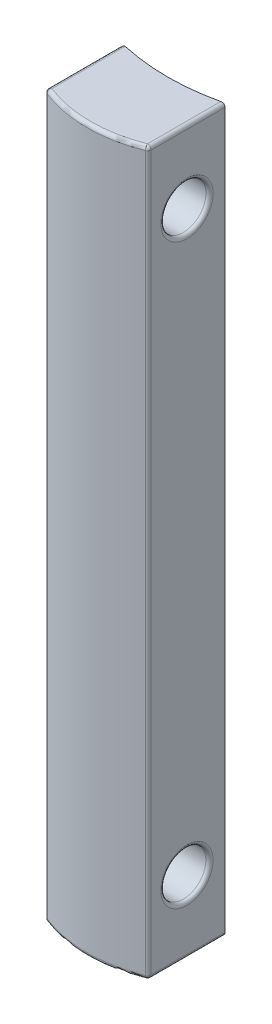
ISO-10303-21;
HEADER;
FILE_DESCRIPTION(('STEP AP214'),'2;1');
FILE_NAME('part.step','',(''),(''),'','','');
FILE_SCHEMA(('AUTOMOTIVE_DESIGN { 1 0 10303 214 1 1 1 1 }'));
ENDSEC;
DATA;
#1=APPLICATION_CONTEXT('core data for automotive mechanical design processes');
#2=APPLICATION_PROTOCOL_DEFINITION('international standard','automotive_design',2000,#1);
#3=PRODUCT_CONTEXT('',#1,'mechanical');
#4=PRODUCT('Part','Part','',(#3));
#5=PRODUCT_RELATED_PRODUCT_CATEGORY('part','',(#4));
#6=PRODUCT_DEFINITION_FORMATION('','',#4);
#7=PRODUCT_DEFINITION_CONTEXT('part definition',#1,'design');
#8=PRODUCT_DEFINITION('design','',#6,#7);
#9=PRODUCT_DEFINITION_SHAPE('','',#8);
#10=(LENGTH_UNIT() NAMED_UNIT(*) SI_UNIT(.MILLI.,.METRE.));
#11=(NAMED_UNIT(*) PLANE_ANGLE_UNIT() SI_UNIT($,.RADIAN.));
#12=(NAMED_UNIT(*) SI_UNIT($,.STERADIAN.) SOLID_ANGLE_UNIT());
#13=UNCERTAINTY_MEASURE_WITH_UNIT(LENGTH_MEASURE(1.E-05),#10,'distance_accuracy_value','');
#14=(GEOMETRIC_REPRESENTATION_CONTEXT(3) GLOBAL_UNCERTAINTY_ASSIGNED_CONTEXT((#13)) GLOBAL_UNIT_ASSIGNED_CONTEXT((#10,
#11,#12)) REPRESENTATION_CONTEXT('',''));
#15=CARTESIAN_POINT('',(0.,0.,0.));
#16=DIRECTION('',(0.,0.,1.));
#17=DIRECTION('',(1.,0.,0.));
#18=AXIS2_PLACEMENT_3D('',#15,#16,#17);
#19=CARTESIAN_POINT('',(0.,254.,-57.5715581610643));
#20=DIRECTION('',(0.,-1.,0.));
#21=DIRECTION('',(0.,0.,-1.));
#22=AXIS2_PLACEMENT_3D('',#19,#20,#21);
#23=CYLINDRICAL_SURFACE('',#22,76.2);
#24=CARTESIAN_POINT('',(0.,0.,-57.5715581610643));
#25=DIRECTION('',(0.,-1.,0.));
#26=DIRECTION('',(0.,0.,1.));
#27=AXIS2_PLACEMENT_3D('',#24,#25,#26);
#28=CIRCLE('',#27,76.2);
#29=CARTESIAN_POINT('',(16.8275,0.,16.747182703875));
#30=VERTEX_POINT('',#29);
#31=CARTESIAN_POINT('',(-16.5516393442623,0.,16.8091062283956));
#32=VERTEX_POINT('',#31);
#33=EDGE_CURVE('E333',#30,#32,#28,.T.);
#34=ORIENTED_EDGE('',*,*,#33,.T.);
#35=DIRECTION('',(0.,-1.,0.));
#36=VECTOR('',#35,1.);
#37=CARTESIAN_POINT('',(-16.5516393442623,254.,16.8091062283956));
#38=LINE('',#37,#36);
#39=CARTESIAN_POINT('',(-16.5516393442623,254.,16.8091062283956));
#40=VERTEX_POINT('',#39);
#41=EDGE_CURVE('E11',#32,#40,#38,.F.);
#42=ORIENTED_EDGE('',*,*,#41,.T.);
#43=CARTESIAN_POINT('',(0.,254.,-57.5715581610643));
#44=DIRECTION('',(0.,-1.,0.));
#45=DIRECTION('',(0.,0.,1.));
#46=AXIS2_PLACEMENT_3D('',#43,#44,#45);
#47=CIRCLE('',#46,76.2);
#48=CARTESIAN_POINT('',(16.8275,254.,16.747182703875));
#49=VERTEX_POINT('',#48);
#50=EDGE_CURVE('E133',#49,#40,#47,.T.);
#51=ORIENTED_EDGE('',*,*,#50,.F.);
#52=CARTESIAN_POINT('',(16.8275,254.,16.747182703875));
#53=CARTESIAN_POINT('',(16.8639896154446,253.999999255623,16.7389207577266));
#54=CARTESIAN_POINT('',(16.9004555622564,253.998426447852,16.7306355715348));
#55=CARTESIAN_POINT('',(16.9731178791203,253.992151677928,16.7140706972601));
#56=CARTESIAN_POINT('',(17.0093142530208,253.987449760534,16.7057910091004));
#57=CARTESIAN_POINT('',(17.117096876584,253.968684983386,16.6810539480163));
#58=CARTESIAN_POINT('',(17.187948906688,253.949963032734,16.6646822066409));
#59=CARTESIAN_POINT('',(17.3255488662206,253.900556070991,16.6326894504217));
#60=CARTESIAN_POINT('',(17.3922941006671,253.869863299272,16.6170689299855));
#61=CARTESIAN_POINT('',(17.5197038858787,253.797296881884,16.5870843439642));
#62=CARTESIAN_POINT('',(17.580370523602,253.755427091826,16.5727198473669));
#63=CARTESIAN_POINT('',(17.6931925521212,253.662085134973,16.5458775267117));
#64=CARTESIAN_POINT('',(17.7454294203061,253.610716671703,16.533381739601));
#65=CARTESIAN_POINT('',(17.8405011805224,253.499467261713,16.5105511135447));
#66=CARTESIAN_POINT('',(17.8833349408527,253.439585291786,16.5002165347162));
#67=CARTESIAN_POINT('',(17.9572047047573,253.314640232585,16.4823425628869));
#68=CARTESIAN_POINT('',(17.9885109280943,253.24974583488,16.4747392663632));
#69=CARTESIAN_POINT('',(18.0397406208682,253.115393440045,16.4622750517539));
#70=CARTESIAN_POINT('',(18.0596754978668,253.045940094677,16.4574113853745));
#71=CARTESIAN_POINT('',(18.0815369441594,252.934915920895,16.4520737763313));
#72=CARTESIAN_POINT('',(18.0875197300893,252.894148018241,16.4506118791123));
#73=CARTESIAN_POINT('',(18.0954998522558,252.812260166365,16.448661316185));
#74=CARTESIAN_POINT('',(18.0975028917215,252.771140805857,16.4481712577721));
#75=CARTESIAN_POINT('',(18.0975,252.73,16.4481722744756));
#76=B_SPLINE_CURVE_WITH_KNOTS('',3,(#52,#53,#54,#55,#56,#57,#58,#59,#60,#61,#62,#63,#64,#65,#66,
#67,#68,#69,#70,#71,#72,#73,#74,#75),.UNSPECIFIED.,.F.,.F.,(4,2,2,2,2,2,2,2,2,2,2,4),(0.,
0.112171064517658,0.224340524551698,0.448459921117349,0.672724855447007,0.896912527389801,
1.11878341774069,1.34068099650411,1.55698405247116,1.77306973315216,1.89657568289654,
2.01990451275881),.UNSPECIFIED.);
#77=CARTESIAN_POINT('',(18.0975,252.73,16.4481722744756));
#78=VERTEX_POINT('',#77);
#79=EDGE_CURVE('E127',#49,#78,#76,.T.);
#80=ORIENTED_EDGE('',*,*,#79,.T.);
#81=DIRECTION('',(0.,-1.,0.));
#82=VECTOR('',#81,1.);
#83=CARTESIAN_POINT('',(18.0975,254.,16.4481722744756));
#84=LINE('',#83,#82);
#85=CARTESIAN_POINT('',(18.0975,1.26999999999999,16.4481722744756));
#86=VERTEX_POINT('',#85);
#87=EDGE_CURVE('E130',#78,#86,#84,.T.);
#88=ORIENTED_EDGE('',*,*,#87,.T.);
#89=CARTESIAN_POINT('',(18.0975,1.26999999999999,16.4481722744756));
#90=CARTESIAN_POINT('',(18.0975002994971,1.23499416079788,16.4481720551778));
#91=CARTESIAN_POINT('',(18.0960517171084,1.20000537635232,16.4485263892362));
#92=CARTESIAN_POINT('',(18.0902763082318,1.1302842807499,16.4499381503823));
#93=CARTESIAN_POINT('',(18.0859497959961,1.09555194200938,16.450995500705));
#94=CARTESIAN_POINT('',(18.0687105809522,0.992231907847696,16.4552062326437));
#95=CARTESIAN_POINT('',(18.0515379752854,0.924346212941687,16.459398361635));
#96=CARTESIAN_POINT('',(18.006388887891,0.79252409307302,16.470392731223));
#97=CARTESIAN_POINT('',(17.978410434683,0.728588391240104,16.4771954481087));
#98=CARTESIAN_POINT('',(17.9125369537443,0.60636419225183,16.4931578929706));
#99=CARTESIAN_POINT('',(17.8746412898318,0.548076057712462,16.5023177721564));
#100=CARTESIAN_POINT('',(17.7895374109295,0.437960695614619,16.5228025752616));
#101=CARTESIAN_POINT('',(17.7422156464106,0.386226249688765,16.5341538400569));
#102=CARTESIAN_POINT('',(17.6399599863692,0.291392389241404,16.5585610241039));
#103=CARTESIAN_POINT('',(17.5850242113896,0.248295113180033,16.5716173641936));
#104=CARTESIAN_POINT('',(17.467519939505,0.170744282521786,16.5993895482886));
#105=CARTESIAN_POINT('',(17.4047858805322,0.136554415411501,16.6141405840076));
#106=CARTESIAN_POINT('',(17.2746745304595,0.0792078885385913,16.6445457298723));
#107=CARTESIAN_POINT('',(17.207298402425,0.0560484765309954,16.6601996136513));
#108=CARTESIAN_POINT('',(17.0876948582205,0.0258327839098748,16.6878076230442));
#109=CARTESIAN_POINT('',(17.0360903788796,0.0161538457197487,16.6996639256655));
#110=CARTESIAN_POINT('',(16.9321673502344,0.00323718304959946,16.7234254207536));
#111=CARTESIAN_POINT('',(16.87984986152,-9.23856613449047E-06,16.7353305253695));
#112=CARTESIAN_POINT('',(16.8275,0.,16.747182703875));
#113=B_SPLINE_CURVE_WITH_KNOTS('',3,(#89,#90,#91,#92,#93,#94,#95,#96,#97,#98,#99,#100,#101,#102,
#103,#104,#105,#106,#107,#108,#109,#110,#111,#112),.UNSPECIFIED.,.F.,.F.,(4,2,2,2,2,2,2,2,2,2,2,
4),(0.,0.104952045724521,0.209892633211034,0.419255642430889,0.628656867088506,
0.838071527970875,1.05018070038622,1.26234232379802,1.48021081926794,1.69802492514076,
1.85913105207359,2.02001920513117),.UNSPECIFIED.);
#114=EDGE_CURVE('E53',#86,#30,#113,.T.);
#115=ORIENTED_EDGE('',*,*,#114,.T.);
#116=EDGE_LOOP('',(#34,#42,#51,#80,#88,#115));
#117=FACE_BOUND('',#116,.T.);
#118=ADVANCED_FACE('F43',(#117),#23,.F.);
#119=CARTESIAN_POINT('',(-18.0975,254.,16.4481722744756));
#120=DIRECTION('',(1.,0.,0.));
#121=DIRECTION('',(0.,0.,-1.));
#122=AXIS2_PLACEMENT_3D('',#119,#120,#121);
#123=PLANE('',#122);
#124=CARTESIAN_POINT('',(-18.0975,228.6,29.9066862681608));
#125=DIRECTION('',(1.,0.,0.));
#126=DIRECTION('',(0.,0.,-1.));
#127=AXIS2_PLACEMENT_3D('',#124,#125,#126);
#128=CIRCLE('',#127,9.2075);
#129=CARTESIAN_POINT('',(-18.0975,228.6,20.6991862681608));
#130=VERTEX_POINT('',#129);
#131=EDGE_CURVE('E189',#130,#130,#128,.T.);
#132=ORIENTED_EDGE('',*,*,#131,.T.);
#133=EDGE_LOOP('',(#132));
#134=FACE_BOUND('',#133,.T.);
#135=CARTESIAN_POINT('',(-18.0975,25.4,29.9066862681608));
#136=DIRECTION('',(1.,0.,0.));
#137=DIRECTION('',(0.,0.,-1.));
#138=AXIS2_PLACEMENT_3D('',#135,#136,#137);
#139=CIRCLE('',#138,9.2075);
#140=CARTESIAN_POINT('',(-18.0975,25.4,20.6991862681608));
#141=VERTEX_POINT('',#140);
#142=EDGE_CURVE('E185',#141,#141,#139,.T.);
#143=ORIENTED_EDGE('',*,*,#142,.T.);
#144=EDGE_LOOP('',(#143));
#145=FACE_BOUND('',#144,.T.);
#146=DIRECTION('',(0.,-1.,0.));
#147=VECTOR('',#146,1.);
#148=CARTESIAN_POINT('',(-18.0975,254.,18.0487839682199));
#149=LINE('',#148,#147);
#150=CARTESIAN_POINT('',(-18.0975,252.73,18.0487839682199));
#151=VERTEX_POINT('',#150);
#152=CARTESIAN_POINT('',(-18.0975,1.26999999999999,18.0487839682199));
#153=VERTEX_POINT('',#152);
#154=EDGE_CURVE('E178',#151,#153,#149,.T.);
#155=ORIENTED_EDGE('',*,*,#154,.T.);
#156=DIRECTION('',(0.,0.,1.));
#157=VECTOR('',#156,1.);
#158=CARTESIAN_POINT('',(-18.0975,1.26999999999999,16.4481722744756));
#159=LINE('',#158,#157);
#160=CARTESIAN_POINT('',(-18.0975,1.26999999999999,42.5106297736225));
#161=VERTEX_POINT('',#160);
#162=EDGE_CURVE('E181',#153,#161,#159,.T.);
#163=ORIENTED_EDGE('',*,*,#162,.T.);
#164=DIRECTION('',(0.,-1.,0.));
#165=VECTOR('',#164,1.);
#166=CARTESIAN_POINT('',(-18.0975,254.,42.5106297736225));
#167=LINE('',#166,#165);
#168=CARTESIAN_POINT('',(-18.0975,252.73,42.5106297736225));
#169=VERTEX_POINT('',#168);
#170=EDGE_CURVE('E172',#161,#169,#167,.F.);
#171=ORIENTED_EDGE('',*,*,#170,.T.);
#172=DIRECTION('',(0.,0.,1.));
#173=VECTOR('',#172,1.);
#174=CARTESIAN_POINT('',(-18.0975,252.73,16.4481722744756));
#175=LINE('',#174,#173);
#176=EDGE_CURVE('E175',#169,#151,#175,.F.);
#177=ORIENTED_EDGE('',*,*,#176,.T.);
#178=EDGE_LOOP('',(#155,#163,#171,#177));
#179=FACE_BOUND('',#178,.T.);
#180=ADVANCED_FACE('F253',(#134,#145,#179),#123,.F.);
#181=CARTESIAN_POINT('',(0.,254.,0.));
#182=DIRECTION('',(0.,-1.,0.));
#183=DIRECTION('',(0.,0.,-1.));
#184=AXIS2_PLACEMENT_3D('',#181,#182,#183);
#185=CYLINDRICAL_SURFACE('',#184,46.99);
#186=CARTESIAN_POINT('',(0.,252.73,0.));
#187=DIRECTION('',(0.,1.,0.));
#188=DIRECTION('',(0.,0.,1.));
#189=AXIS2_PLACEMENT_3D('',#186,#187,#188);
#190=CIRCLE('',#189,46.99);
#191=CARTESIAN_POINT('',(17.2949305555556,252.73,43.6914806006676));
#192=VERTEX_POINT('',#191);
#193=CARTESIAN_POINT('',(-17.2949305555556,252.73,43.6914806006676));
#194=VERTEX_POINT('',#193);
#195=EDGE_CURVE('E220',#192,#194,#190,.F.);
#196=ORIENTED_EDGE('',*,*,#195,.T.);
#197=DIRECTION('',(0.,-1.,0.));
#198=VECTOR('',#197,1.);
#199=CARTESIAN_POINT('',(-17.2949305555556,254.,43.6914806006676));
#200=LINE('',#199,#198);
#201=CARTESIAN_POINT('',(-17.2949305555556,1.26999999999999,43.6914806006676));
#202=VERTEX_POINT('',#201);
#203=EDGE_CURVE('E224',#194,#202,#200,.T.);
#204=ORIENTED_EDGE('',*,*,#203,.T.);
#205=CARTESIAN_POINT('',(0.,1.26999999999999,0.));
#206=DIRECTION('',(0.,1.,0.));
#207=DIRECTION('',(0.,0.,1.));
#208=AXIS2_PLACEMENT_3D('',#205,#206,#207);
#209=CIRCLE('',#208,46.99);
#210=CARTESIAN_POINT('',(17.2949305555556,1.26999999999999,43.6914806006676));
#211=VERTEX_POINT('',#210);
#212=EDGE_CURVE('E217',#202,#211,#209,.T.);
#213=ORIENTED_EDGE('',*,*,#212,.T.);
#214=DIRECTION('',(0.,-1.,0.));
#215=VECTOR('',#214,1.);
#216=CARTESIAN_POINT('',(17.2949305555556,254.,43.6914806006676));
#217=LINE('',#216,#215);
#218=EDGE_CURVE('E214',#211,#192,#217,.F.);
#219=ORIENTED_EDGE('',*,*,#218,.T.);
#220=EDGE_LOOP('',(#196,#204,#213,#219));
#221=FACE_BOUND('',#220,.T.);
#222=ADVANCED_FACE('F359',(#221),#185,.T.);
#223=CARTESIAN_POINT('',(18.0975,254.,16.4481722744756));
#224=DIRECTION('',(-1.,0.,0.));
#225=DIRECTION('',(0.,0.,1.));
#226=AXIS2_PLACEMENT_3D('',#223,#224,#225);
#227=PLANE('',#226);
#228=CARTESIAN_POINT('',(18.0975,228.6,29.9066862681608));
#229=DIRECTION('',(-1.,0.,0.));
#230=DIRECTION('',(0.,0.,1.));
#231=AXIS2_PLACEMENT_3D('',#228,#229,#230);
#232=CIRCLE('',#231,9.2075);
#233=CARTESIAN_POINT('',(18.0975,228.6,39.1141862681608));
#234=VERTEX_POINT('',#233);
#235=EDGE_CURVE('E168',#234,#234,#232,.T.);
#236=ORIENTED_EDGE('',*,*,#235,.T.);
#237=EDGE_LOOP('',(#236));
#238=FACE_BOUND('',#237,.T.);
#239=CARTESIAN_POINT('',(18.0975,25.4,29.9066862681608));
#240=DIRECTION('',(-1.,0.,0.));
#241=DIRECTION('',(0.,0.,1.));
#242=AXIS2_PLACEMENT_3D('',#239,#240,#241);
#243=CIRCLE('',#242,9.2075);
#244=CARTESIAN_POINT('',(18.0975,25.4,39.1141862681608));
#245=VERTEX_POINT('',#244);
#246=EDGE_CURVE('E159',#245,#245,#243,.T.);
#247=ORIENTED_EDGE('',*,*,#246,.T.);
#248=EDGE_LOOP('',(#247));
#249=FACE_BOUND('',#248,.T.);
#250=DIRECTION('',(0.,-1.,0.));
#251=VECTOR('',#250,1.);
#252=CARTESIAN_POINT('',(18.0975,254.,42.5106297736225));
#253=LINE('',#252,#251);
#254=CARTESIAN_POINT('',(18.0975,252.73,42.5106297736225));
#255=VERTEX_POINT('',#254);
#256=CARTESIAN_POINT('',(18.0975,1.26999999999999,42.5106297736225));
#257=VERTEX_POINT('',#256);
#258=EDGE_CURVE('E155',#255,#257,#253,.T.);
#259=ORIENTED_EDGE('',*,*,#258,.T.);
#260=DIRECTION('',(0.,0.,-1.));
#261=VECTOR('',#260,1.);
#262=CARTESIAN_POINT('',(18.0975,1.26999999999999,16.4481722744756));
#263=LINE('',#262,#261);
#264=EDGE_CURVE('E145',#257,#86,#263,.T.);
#265=ORIENTED_EDGE('',*,*,#264,.T.);
#266=ORIENTED_EDGE('',*,*,#87,.F.);
#267=DIRECTION('',(0.,0.,-1.));
#268=VECTOR('',#267,1.);
#269=CARTESIAN_POINT('',(18.0975,252.73,43.3652002618459));
#270=LINE('',#269,#268);
#271=EDGE_CURVE('E142',#78,#255,#270,.F.);
#272=ORIENTED_EDGE('',*,*,#271,.T.);
#273=EDGE_LOOP('',(#259,#265,#266,#272));
#274=FACE_BOUND('',#273,.T.);
#275=ADVANCED_FACE('F141',(#238,#249,#274),#227,.F.);
#276=CARTESIAN_POINT('',(0.,254.,-57.5715581610643));
#277=DIRECTION('',(0.,1.,0.));
#278=DIRECTION('',(0.,0.,1.));
#279=AXIS2_PLACEMENT_3D('',#276,#277,#278);
#280=PLANE('',#279);
#281=ORIENTED_EDGE('',*,*,#50,.T.);
#282=CARTESIAN_POINT('',(-16.8275,254.,18.0487839682199));
#283=DIRECTION('',(0.,1.,0.));
#284=DIRECTION('',(0.,0.,1.));
#285=AXIS2_PLACEMENT_3D('',#282,#283,#284);
#286=CIRCLE('',#285,1.27);
#287=CARTESIAN_POINT('',(-16.8275,254.,16.7787839682199));
#288=VERTEX_POINT('',#287);
#289=EDGE_CURVE('E211',#40,#288,#286,.T.);
#290=ORIENTED_EDGE('',*,*,#289,.T.);
#291=DIRECTION('',(0.,0.,1.));
#292=VECTOR('',#291,1.);
#293=CARTESIAN_POINT('',(-16.8275,254.,43.3652002618459));
#294=LINE('',#293,#292);
#295=CARTESIAN_POINT('',(-16.8275,254.,42.5106297736225));
#296=VERTEX_POINT('',#295);
#297=EDGE_CURVE('E208',#288,#296,#294,.T.);
#298=ORIENTED_EDGE('',*,*,#297,.T.);
#299=CARTESIAN_POINT('',(0.,254.,0.));
#300=DIRECTION('',(0.,1.,0.));
#301=DIRECTION('',(0.,0.,1.));
#302=AXIS2_PLACEMENT_3D('',#299,#300,#301);
#303=CIRCLE('',#302,45.72);
#304=CARTESIAN_POINT('',(16.8275,254.,42.5106297736225));
#305=VERTEX_POINT('',#304);
#306=EDGE_CURVE('E204',#296,#305,#303,.T.);
#307=ORIENTED_EDGE('',*,*,#306,.T.);
#308=DIRECTION('',(0.,0.,-1.));
#309=VECTOR('',#308,1.);
#310=CARTESIAN_POINT('',(16.8275,254.,16.4481722744756));
#311=LINE('',#310,#309);
#312=EDGE_CURVE('E201',#305,#49,#311,.T.);
#313=ORIENTED_EDGE('',*,*,#312,.T.);
#314=EDGE_LOOP('',(#281,#290,#298,#307,#313));
#315=FACE_BOUND('',#314,.T.);
#316=ADVANCED_FACE('F438',(#315),#280,.T.);
#317=CARTESIAN_POINT('',(0.,0.,-57.5715581610643));
#318=DIRECTION('',(0.,1.,0.));
#319=DIRECTION('',(0.,0.,1.));
#320=AXIS2_PLACEMENT_3D('',#317,#318,#319);
#321=PLANE('',#320);
#322=DIRECTION('',(0.,0.,1.));
#323=VECTOR('',#322,1.);
#324=CARTESIAN_POINT('',(-16.8275,0.,-57.5715581610643));
#325=LINE('',#324,#323);
#326=CARTESIAN_POINT('',(-16.8275,0.,42.5106297736225));
#327=VERTEX_POINT('',#326);
#328=CARTESIAN_POINT('',(-16.8275,0.,16.7787839682199));
#329=VERTEX_POINT('',#328);
#330=EDGE_CURVE('E61',#327,#329,#325,.F.);
#331=ORIENTED_EDGE('',*,*,#330,.T.);
#332=CARTESIAN_POINT('',(-16.8275,0.,18.0487839682199));
#333=DIRECTION('',(0.,1.,0.));
#334=DIRECTION('',(0.,0.,1.));
#335=AXIS2_PLACEMENT_3D('',#332,#333,#334);
#336=CIRCLE('',#335,1.27);
#337=EDGE_CURVE('E138',#329,#32,#336,.F.);
#338=ORIENTED_EDGE('',*,*,#337,.T.);
#339=ORIENTED_EDGE('',*,*,#33,.F.);
#340=DIRECTION('',(0.,0.,-1.));
#341=VECTOR('',#340,1.);
#342=CARTESIAN_POINT('',(16.8275,0.,-57.5715581610643));
#343=LINE('',#342,#341);
#344=CARTESIAN_POINT('',(16.8275,0.,42.5106297736225));
#345=VERTEX_POINT('',#344);
#346=EDGE_CURVE('E229',#30,#345,#343,.F.);
#347=ORIENTED_EDGE('',*,*,#346,.T.);
#348=CARTESIAN_POINT('',(0.,0.,0.));
#349=DIRECTION('',(0.,1.,0.));
#350=DIRECTION('',(0.,0.,1.));
#351=AXIS2_PLACEMENT_3D('',#348,#349,#350);
#352=CIRCLE('',#351,45.72);
#353=EDGE_CURVE('E66',#345,#327,#352,.F.);
#354=ORIENTED_EDGE('',*,*,#353,.T.);
#355=EDGE_LOOP('',(#331,#338,#339,#347,#354));
#356=FACE_BOUND('',#355,.T.);
#357=ADVANCED_FACE('F371',(#356),#321,.F.);
#358=CARTESIAN_POINT('',(-18.0975,25.4,29.9066862681608));
#359=DIRECTION('',(1.,0.,0.));
#360=DIRECTION('',(0.,0.,-1.));
#361=AXIS2_PLACEMENT_3D('',#358,#359,#360);
#362=CYLINDRICAL_SURFACE('',#361,7.9375);
#363=CARTESIAN_POINT('',(16.8275,25.4,29.9066862681608));
#364=DIRECTION('',(-1.,0.,0.));
#365=DIRECTION('',(0.,0.,1.));
#366=AXIS2_PLACEMENT_3D('',#363,#364,#365);
#367=CIRCLE('',#366,7.9375);
#368=CARTESIAN_POINT('',(16.8275,25.4,21.9691862681608));
#369=VERTEX_POINT('',#368);
#370=EDGE_CURVE('E197',#369,#369,#367,.F.);
#371=CARTESIAN_POINT('',(-16.8275,25.4,29.9066862681608));
#372=DIRECTION('',(1.,0.,0.));
#373=DIRECTION('',(0.,0.,-1.));
#374=AXIS2_PLACEMENT_3D('',#371,#372,#373);
#375=CIRCLE('',#374,7.9375);
#376=CARTESIAN_POINT('',(-16.8275,25.4,21.9691862681608));
#377=VERTEX_POINT('',#376);
#378=EDGE_CURVE('E193',#377,#377,#375,.F.);
#379=CARTESIAN_POINT('',(16.8275,25.4,21.9691862681608));
#380=CARTESIAN_POINT('',(16.4769270833333,25.4,21.9691862681608));
#381=CARTESIAN_POINT('',(16.1263541666667,25.4,21.9691862681608));
#382=CARTESIAN_POINT('',(15.4252083333333,25.4,21.9691862681608));
#383=CARTESIAN_POINT('',(15.0746354166667,25.4,21.9691862681608));
#384=CARTESIAN_POINT('',(14.3734895833333,25.4,21.9691862681608));
#385=CARTESIAN_POINT('',(14.0229166666667,25.4,21.9691862681608));
#386=CARTESIAN_POINT('',(13.3217708333333,25.4,21.9691862681608));
#387=CARTESIAN_POINT('',(12.9711979166667,25.4,21.9691862681608));
#388=CARTESIAN_POINT('',(12.2700520833333,25.4,21.9691862681608));
#389=CARTESIAN_POINT('',(11.9194791666667,25.4,21.9691862681608));
#390=CARTESIAN_POINT('',(11.2183333333333,25.4,21.9691862681608));
#391=CARTESIAN_POINT('',(10.8677604166667,25.4,21.9691862681608));
#392=CARTESIAN_POINT('',(10.1666145833333,25.4,21.9691862681608));
#393=CARTESIAN_POINT('',(9.81604166666667,25.4,21.9691862681608));
#394=CARTESIAN_POINT('',(9.11489583333333,25.4,21.9691862681608));
#395=CARTESIAN_POINT('',(8.76432291666667,25.4,21.9691862681608));
#396=CARTESIAN_POINT('',(8.06317708333333,25.4,21.9691862681608));
#397=CARTESIAN_POINT('',(7.71260416666667,25.4,21.9691862681608));
#398=CARTESIAN_POINT('',(7.01145833333333,25.4,21.9691862681608));
#399=CARTESIAN_POINT('',(6.66088541666667,25.4,21.9691862681608));
#400=CARTESIAN_POINT('',(5.95973958333333,25.4,21.9691862681608));
#401=CARTESIAN_POINT('',(5.60916666666667,25.4,21.9691862681608));
#402=CARTESIAN_POINT('',(4.90802083333333,25.4,21.9691862681608));
#403=CARTESIAN_POINT('',(4.55744791666667,25.4,21.9691862681608));
#404=CARTESIAN_POINT('',(3.85630208333333,25.4,21.9691862681608));
#405=CARTESIAN_POINT('',(3.50572916666667,25.4,21.9691862681608));
#406=CARTESIAN_POINT('',(2.80458333333333,25.4,21.9691862681608));
#407=CARTESIAN_POINT('',(2.45401041666667,25.4,21.9691862681608));
#408=CARTESIAN_POINT('',(1.75286458333333,25.4,21.9691862681608));
#409=CARTESIAN_POINT('',(1.40229166666667,25.4,21.9691862681608));
#410=CARTESIAN_POINT('',(0.701145833333333,25.4,21.9691862681608));
#411=CARTESIAN_POINT('',(0.350572916666667,25.4,21.9691862681608));
#412=CARTESIAN_POINT('',(-0.350572916666667,25.4,21.9691862681608));
#413=CARTESIAN_POINT('',(-0.701145833333333,25.4,21.9691862681608));
#414=CARTESIAN_POINT('',(-1.40229166666667,25.4,21.9691862681608));
#415=CARTESIAN_POINT('',(-1.75286458333333,25.4,21.9691862681608));
#416=CARTESIAN_POINT('',(-2.45401041666667,25.4,21.9691862681608));
#417=CARTESIAN_POINT('',(-2.80458333333333,25.4,21.9691862681608));
#418=CARTESIAN_POINT('',(-3.50572916666666,25.4,21.9691862681608));
#419=CARTESIAN_POINT('',(-3.85630208333333,25.4,21.9691862681608));
#420=CARTESIAN_POINT('',(-4.55744791666667,25.4,21.9691862681608));
#421=CARTESIAN_POINT('',(-4.90802083333333,25.4,21.9691862681608));
#422=CARTESIAN_POINT('',(-5.60916666666667,25.4,21.9691862681608));
#423=CARTESIAN_POINT('',(-5.95973958333333,25.4,21.9691862681608));
#424=CARTESIAN_POINT('',(-6.66088541666667,25.4,21.9691862681608));
#425=CARTESIAN_POINT('',(-7.01145833333333,25.4,21.9691862681608));
#426=CARTESIAN_POINT('',(-7.71260416666667,25.4,21.9691862681608));
#427=CARTESIAN_POINT('',(-8.06317708333333,25.4,21.9691862681608));
#428=CARTESIAN_POINT('',(-8.76432291666667,25.4,21.9691862681608));
#429=CARTESIAN_POINT('',(-9.11489583333333,25.4,21.9691862681608));
#430=CARTESIAN_POINT('',(-9.81604166666667,25.4,21.9691862681608));
#431=CARTESIAN_POINT('',(-10.1666145833333,25.4,21.9691862681608));
#432=CARTESIAN_POINT('',(-10.8677604166667,25.4,21.9691862681608));
#433=CARTESIAN_POINT('',(-11.2183333333333,25.4,21.9691862681608));
#434=CARTESIAN_POINT('',(-11.9194791666667,25.4,21.9691862681608));
#435=CARTESIAN_POINT('',(-12.2700520833333,25.4,21.9691862681608));
#436=CARTESIAN_POINT('',(-12.9711979166667,25.4,21.9691862681608));
#437=CARTESIAN_POINT('',(-13.3217708333333,25.4,21.9691862681608));
#438=CARTESIAN_POINT('',(-14.0229166666667,25.4,21.9691862681608));
#439=CARTESIAN_POINT('',(-14.3734895833333,25.4,21.9691862681608));
#440=CARTESIAN_POINT('',(-15.0746354166667,25.4,21.9691862681608));
#441=CARTESIAN_POINT('',(-15.4252083333333,25.4,21.9691862681608));
#442=CARTESIAN_POINT('',(-16.1263541666667,25.4,21.9691862681608));
#443=CARTESIAN_POINT('',(-16.4769270833333,25.4,21.9691862681608));
#444=CARTESIAN_POINT('',(-16.8275,25.4,21.9691862681608));
#445=B_SPLINE_CURVE_WITH_KNOTS('',3,(#379,#380,#381,#382,#383,#384,#385,#386,#387,#388,#389,
#390,#391,#392,#393,#394,#395,#396,#397,#398,#399,#400,#401,#402,#403,#404,#405,#406,#407,#408,
#409,#410,#411,#412,#413,#414,#415,#416,#417,#418,#419,#420,#421,#422,#423,#424,#425,#426,#427,
#428,#429,#430,#431,#432,#433,#434,#435,#436,#437,#438,#439,#440,#441,#442,#443,#444),
.UNSPECIFIED.,.F.,.F.,(4,2,2,2,2,2,2,2,2,2,2,2,2,2,2,2,2,2,2,2,2,2,2,2,2,2,2,2,2,2,2,2,4),(0.,
1.05171875,2.1034375,3.15515625,4.206875,5.25859374999999,6.3103125,7.36203125,8.41375,
9.46546875,10.5171875,11.56890625,12.620625,13.67234375,14.7240625,15.77578125,16.8275,
17.87921875,18.9309375,19.98265625,21.034375,22.08609375,23.1378125,24.18953125,25.24125,
26.29296875,27.3446875,28.39640625,29.448125,30.49984375,31.5515625,32.60328125,33.655),.UNSPECIFIED.);
#446=EDGE_CURVE('BSEAM351',#369,#377,#445,.T.);
#447=ORIENTED_EDGE('',*,*,#370,.T.);
#448=ORIENTED_EDGE('',*,*,#378,.T.);
#449=ORIENTED_EDGE('',*,*,#446,.T.);
#450=ORIENTED_EDGE('',*,*,#446,.F.);
#451=EDGE_LOOP('',(#447,#449,#448,#450));
#452=FACE_BOUND('',#451,.T.);
#453=ADVANCED_FACE('F351',(#452),#362,.F.);
#454=CARTESIAN_POINT('',(-18.0975,228.6,29.9066862681608));
#455=DIRECTION('',(1.,0.,0.));
#456=DIRECTION('',(0.,0.,-1.));
#457=AXIS2_PLACEMENT_3D('',#454,#455,#456);
#458=CYLINDRICAL_SURFACE('',#457,7.9375);
#459=CARTESIAN_POINT('',(16.8275,228.6,29.9066862681608));
#460=DIRECTION('',(-1.,0.,0.));
#461=DIRECTION('',(0.,0.,1.));
#462=AXIS2_PLACEMENT_3D('',#459,#460,#461);
#463=CIRCLE('',#462,7.9375);
#464=CARTESIAN_POINT('',(16.8275,228.6,21.9691862681608));
#465=VERTEX_POINT('',#464);
#466=EDGE_CURVE('E161',#465,#465,#463,.F.);
#467=CARTESIAN_POINT('',(-16.8275,228.6,29.9066862681608));
#468=DIRECTION('',(1.,0.,0.));
#469=DIRECTION('',(0.,0.,-1.));
#470=AXIS2_PLACEMENT_3D('',#467,#468,#469);
#471=CIRCLE('',#470,7.9375);
#472=CARTESIAN_POINT('',(-16.8275,228.6,21.9691862681608));
#473=VERTEX_POINT('',#472);
#474=EDGE_CURVE('E147',#473,#473,#471,.F.);
#475=CARTESIAN_POINT('',(16.8275,228.6,21.9691862681608));
#476=CARTESIAN_POINT('',(16.4769270833333,228.6,21.9691862681608));
#477=CARTESIAN_POINT('',(16.1263541666667,228.6,21.9691862681608));
#478=CARTESIAN_POINT('',(15.4252083333333,228.6,21.9691862681608));
#479=CARTESIAN_POINT('',(15.0746354166667,228.6,21.9691862681608));
#480=CARTESIAN_POINT('',(14.3734895833333,228.6,21.9691862681608));
#481=CARTESIAN_POINT('',(14.0229166666667,228.6,21.9691862681608));
#482=CARTESIAN_POINT('',(13.3217708333333,228.6,21.9691862681608));
#483=CARTESIAN_POINT('',(12.9711979166667,228.6,21.9691862681608));
#484=CARTESIAN_POINT('',(12.2700520833333,228.6,21.9691862681608));
#485=CARTESIAN_POINT('',(11.9194791666667,228.6,21.9691862681608));
#486=CARTESIAN_POINT('',(11.2183333333333,228.6,21.9691862681608));
#487=CARTESIAN_POINT('',(10.8677604166667,228.6,21.9691862681608));
#488=CARTESIAN_POINT('',(10.1666145833333,228.6,21.9691862681608));
#489=CARTESIAN_POINT('',(9.81604166666667,228.6,21.9691862681608));
#490=CARTESIAN_POINT('',(9.11489583333333,228.6,21.9691862681608));
#491=CARTESIAN_POINT('',(8.76432291666667,228.6,21.9691862681608));
#492=CARTESIAN_POINT('',(8.06317708333333,228.6,21.9691862681608));
#493=CARTESIAN_POINT('',(7.71260416666667,228.6,21.9691862681608));
#494=CARTESIAN_POINT('',(7.01145833333333,228.6,21.9691862681608));
#495=CARTESIAN_POINT('',(6.66088541666667,228.6,21.9691862681608));
#496=CARTESIAN_POINT('',(5.95973958333333,228.6,21.9691862681608));
#497=CARTESIAN_POINT('',(5.60916666666667,228.6,21.9691862681608));
#498=CARTESIAN_POINT('',(4.90802083333333,228.6,21.9691862681608));
#499=CARTESIAN_POINT('',(4.55744791666667,228.6,21.9691862681608));
#500=CARTESIAN_POINT('',(3.85630208333333,228.6,21.9691862681608));
#501=CARTESIAN_POINT('',(3.50572916666667,228.6,21.9691862681608));
#502=CARTESIAN_POINT('',(2.80458333333333,228.6,21.9691862681608));
#503=CARTESIAN_POINT('',(2.45401041666667,228.6,21.9691862681608));
#504=CARTESIAN_POINT('',(1.75286458333333,228.6,21.9691862681608));
#505=CARTESIAN_POINT('',(1.40229166666667,228.6,21.9691862681608));
#506=CARTESIAN_POINT('',(0.701145833333333,228.6,21.9691862681608));
#507=CARTESIAN_POINT('',(0.350572916666667,228.6,21.9691862681608));
#508=CARTESIAN_POINT('',(-0.350572916666667,228.6,21.9691862681608));
#509=CARTESIAN_POINT('',(-0.701145833333333,228.6,21.9691862681608));
#510=CARTESIAN_POINT('',(-1.40229166666667,228.6,21.9691862681608));
#511=CARTESIAN_POINT('',(-1.75286458333333,228.6,21.9691862681608));
#512=CARTESIAN_POINT('',(-2.45401041666667,228.6,21.9691862681608));
#513=CARTESIAN_POINT('',(-2.80458333333333,228.6,21.9691862681608));
#514=CARTESIAN_POINT('',(-3.50572916666666,228.6,21.9691862681608));
#515=CARTESIAN_POINT('',(-3.85630208333333,228.6,21.9691862681608));
#516=CARTESIAN_POINT('',(-4.55744791666667,228.6,21.9691862681608));
#517=CARTESIAN_POINT('',(-4.90802083333333,228.6,21.9691862681608));
#518=CARTESIAN_POINT('',(-5.60916666666667,228.6,21.9691862681608));
#519=CARTESIAN_POINT('',(-5.95973958333333,228.6,21.9691862681608));
#520=CARTESIAN_POINT('',(-6.66088541666667,228.6,21.9691862681608));
#521=CARTESIAN_POINT('',(-7.01145833333333,228.6,21.9691862681608));
#522=CARTESIAN_POINT('',(-7.71260416666667,228.6,21.9691862681608));
#523=CARTESIAN_POINT('',(-8.06317708333333,228.6,21.9691862681608));
#524=CARTESIAN_POINT('',(-8.76432291666667,228.6,21.9691862681608));
#525=CARTESIAN_POINT('',(-9.11489583333333,228.6,21.9691862681608));
#526=CARTESIAN_POINT('',(-9.81604166666667,228.6,21.9691862681608));
#527=CARTESIAN_POINT('',(-10.1666145833333,228.6,21.9691862681608));
#528=CARTESIAN_POINT('',(-10.8677604166667,228.6,21.9691862681608));
#529=CARTESIAN_POINT('',(-11.2183333333333,228.6,21.9691862681608));
#530=CARTESIAN_POINT('',(-11.9194791666667,228.6,21.9691862681608));
#531=CARTESIAN_POINT('',(-12.2700520833333,228.6,21.9691862681608));
#532=CARTESIAN_POINT('',(-12.9711979166667,228.6,21.9691862681608));
#533=CARTESIAN_POINT('',(-13.3217708333333,228.6,21.9691862681608));
#534=CARTESIAN_POINT('',(-14.0229166666667,228.6,21.9691862681608));
#535=CARTESIAN_POINT('',(-14.3734895833333,228.6,21.9691862681608));
#536=CARTESIAN_POINT('',(-15.0746354166667,228.6,21.9691862681608));
#537=CARTESIAN_POINT('',(-15.4252083333333,228.6,21.9691862681608));
#538=CARTESIAN_POINT('',(-16.1263541666667,228.6,21.9691862681608));
#539=CARTESIAN_POINT('',(-16.4769270833333,228.6,21.9691862681608));
#540=CARTESIAN_POINT('',(-16.8275,228.6,21.9691862681608));
#541=B_SPLINE_CURVE_WITH_KNOTS('',3,(#475,#476,#477,#478,#479,#480,#481,#482,#483,#484,#485,
#486,#487,#488,#489,#490,#491,#492,#493,#494,#495,#496,#497,#498,#499,#500,#501,#502,#503,#504,
#505,#506,#507,#508,#509,#510,#511,#512,#513,#514,#515,#516,#517,#518,#519,#520,#521,#522,#523,
#524,#525,#526,#527,#528,#529,#530,#531,#532,#533,#534,#535,#536,#537,#538,#539,#540),
.UNSPECIFIED.,.F.,.F.,(4,2,2,2,2,2,2,2,2,2,2,2,2,2,2,2,2,2,2,2,2,2,2,2,2,2,2,2,2,2,2,2,4),(0.,
1.05171875,2.1034375,3.15515625,4.206875,5.25859374999999,6.3103125,7.36203125,8.41375,
9.46546875,10.5171875,11.56890625,12.620625,13.67234375,14.7240625,15.77578125,16.8275,
17.87921875,18.9309375,19.98265625,21.034375,22.08609375,23.1378125,24.18953125,25.24125,
26.29296875,27.3446875,28.39640625,29.448125,30.49984375,31.5515625,32.60328125,33.655),.UNSPECIFIED.);
#542=EDGE_CURVE('BSEAM260',#465,#473,#541,.T.);
#543=ORIENTED_EDGE('',*,*,#466,.T.);
#544=ORIENTED_EDGE('',*,*,#474,.T.);
#545=ORIENTED_EDGE('',*,*,#542,.T.);
#546=ORIENTED_EDGE('',*,*,#542,.F.);
#547=EDGE_LOOP('',(#543,#545,#544,#546));
#548=FACE_BOUND('',#547,.T.);
#549=ADVANCED_FACE('F260',(#548),#458,.F.);
#550=CARTESIAN_POINT('',(16.8275,228.6,29.9066862681608));
#551=DIRECTION('',(-1.,0.,0.));
#552=DIRECTION('',(0.,0.,1.));
#553=AXIS2_PLACEMENT_3D('',#550,#551,#552);
#554=TOROIDAL_SURFACE('',#553,9.2075,1.27);
#555=ORIENTED_EDGE('',*,*,#235,.F.);
#556=EDGE_LOOP('',(#555));
#557=FACE_BOUND('',#556,.T.);
#558=ORIENTED_EDGE('',*,*,#466,.F.);
#559=EDGE_LOOP('',(#558));
#560=FACE_BOUND('',#559,.T.);
#561=ADVANCED_FACE('F255',(#557,#560),#554,.T.);
#562=CARTESIAN_POINT('',(-16.8275,228.6,29.9066862681608));
#563=DIRECTION('',(1.,0.,0.));
#564=DIRECTION('',(0.,0.,-1.));
#565=AXIS2_PLACEMENT_3D('',#562,#563,#564);
#566=TOROIDAL_SURFACE('',#565,9.2075,1.27);
#567=ORIENTED_EDGE('',*,*,#474,.F.);
#568=EDGE_LOOP('',(#567));
#569=FACE_BOUND('',#568,.T.);
#570=ORIENTED_EDGE('',*,*,#131,.F.);
#571=EDGE_LOOP('',(#570));
#572=FACE_BOUND('',#571,.T.);
#573=ADVANCED_FACE('F259',(#569,#572),#566,.T.);
#574=CARTESIAN_POINT('',(16.8275,25.4,29.9066862681608));
#575=DIRECTION('',(-1.,0.,0.));
#576=DIRECTION('',(0.,0.,1.));
#577=AXIS2_PLACEMENT_3D('',#574,#575,#576);
#578=TOROIDAL_SURFACE('',#577,9.2075,1.27);
#579=ORIENTED_EDGE('',*,*,#246,.F.);
#580=EDGE_LOOP('',(#579));
#581=FACE_BOUND('',#580,.T.);
#582=ORIENTED_EDGE('',*,*,#370,.F.);
#583=EDGE_LOOP('',(#582));
#584=FACE_BOUND('',#583,.T.);
#585=ADVANCED_FACE('F264',(#581,#584),#578,.T.);
#586=CARTESIAN_POINT('',(-16.8275,25.4,29.9066862681608));
#587=DIRECTION('',(1.,0.,0.));
#588=DIRECTION('',(0.,0.,-1.));
#589=AXIS2_PLACEMENT_3D('',#586,#587,#588);
#590=TOROIDAL_SURFACE('',#589,9.2075,1.27);
#591=ORIENTED_EDGE('',*,*,#378,.F.);
#592=EDGE_LOOP('',(#591));
#593=FACE_BOUND('',#592,.T.);
#594=ORIENTED_EDGE('',*,*,#142,.F.);
#595=EDGE_LOOP('',(#594));
#596=FACE_BOUND('',#595,.T.);
#597=ADVANCED_FACE('F268',(#593,#596),#590,.T.);
#598=CARTESIAN_POINT('',(-16.8275,1.26999999999999,16.4481722744756));
#599=DIRECTION('',(0.,0.,1.));
#600=DIRECTION('',(1.,0.,0.));
#601=AXIS2_PLACEMENT_3D('',#598,#599,#600);
#602=CYLINDRICAL_SURFACE('',#601,1.27);
#603=CARTESIAN_POINT('',(-16.8275,1.26999999999999,18.0487839682199));
#604=DIRECTION('',(0.,-0.707106781186547,0.707106781186547));
#605=DIRECTION('',(0.,-0.707106781186547,-0.707106781186547));
#606=AXIS2_PLACEMENT_3D('',#603,#604,#605);
#607=ELLIPSE('',#606,1.79605122421383,1.27);
#608=EDGE_CURVE('E322',#329,#153,#607,.F.);
#609=ORIENTED_EDGE('',*,*,#608,.F.);
#610=ORIENTED_EDGE('',*,*,#330,.F.);
#611=CARTESIAN_POINT('',(-16.8275,1.26999999999999,42.5106297736225));
#612=DIRECTION('',(0.,0.,1.));
#613=DIRECTION('',(0.,-1.,0.));
#614=AXIS2_PLACEMENT_3D('',#611,#612,#613);
#615=CIRCLE('',#614,1.27);
#616=EDGE_CURVE('E325',#161,#327,#615,.T.);
#617=ORIENTED_EDGE('',*,*,#616,.F.);
#618=ORIENTED_EDGE('',*,*,#162,.F.);
#619=EDGE_LOOP('',(#609,#610,#617,#618));
#620=FACE_BOUND('',#619,.T.);
#621=ADVANCED_FACE('F45',(#620),#602,.T.);
#622=CARTESIAN_POINT('',(16.8275,1.26999999999999,16.4481722744756));
#623=DIRECTION('',(0.,0.,-1.));
#624=DIRECTION('',(-1.,0.,0.));
#625=AXIS2_PLACEMENT_3D('',#622,#623,#624);
#626=CYLINDRICAL_SURFACE('',#625,1.27);
#627=ORIENTED_EDGE('',*,*,#114,.F.);
#628=ORIENTED_EDGE('',*,*,#264,.F.);
#629=CARTESIAN_POINT('',(16.8275,1.27,42.5106297736225));
#630=DIRECTION('',(0.,0.,1.));
#631=DIRECTION('',(1.,0.,0.));
#632=AXIS2_PLACEMENT_3D('',#629,#630,#631);
#633=CIRCLE('',#632,1.27);
#634=EDGE_CURVE('E319',#345,#257,#633,.T.);
#635=ORIENTED_EDGE('',*,*,#634,.F.);
#636=ORIENTED_EDGE('',*,*,#346,.F.);
#637=EDGE_LOOP('',(#627,#628,#635,#636));
#638=FACE_BOUND('',#637,.T.);
#639=ADVANCED_FACE('F375',(#638),#626,.T.);
#640=CARTESIAN_POINT('',(0.,1.26999999999999,0.));
#641=DIRECTION('',(0.,1.,0.));
#642=DIRECTION('',(0.,0.,1.));
#643=AXIS2_PLACEMENT_3D('',#640,#641,#642);
#644=TOROIDAL_SURFACE('',#643,45.72,1.27);
#645=CARTESIAN_POINT('',(-16.8275,1.27,42.5106297736225));
#646=DIRECTION('',(-0.929803800822889,0.,-0.368055555555557));
#647=DIRECTION('',(-0.368055555555557,0.,0.929803800822889));
#648=AXIS2_PLACEMENT_3D('',#645,#646,#647);
#649=CIRCLE('',#648,1.27);
#650=EDGE_CURVE('E47',#327,#202,#649,.T.);
#651=ORIENTED_EDGE('',*,*,#650,.F.);
#652=ORIENTED_EDGE('',*,*,#353,.F.);
#653=CARTESIAN_POINT('',(16.8275,1.26999999999999,42.5106297736225));
#654=DIRECTION('',(0.92980380082289,0.,-0.368055555555555));
#655=DIRECTION('',(-0.368055555555555,0.,-0.92980380082289));
#656=AXIS2_PLACEMENT_3D('',#653,#654,#655);
#657=CIRCLE('',#656,1.27);
#658=EDGE_CURVE('E316',#211,#345,#657,.T.);
#659=ORIENTED_EDGE('',*,*,#658,.F.);
#660=ORIENTED_EDGE('',*,*,#212,.F.);
#661=EDGE_LOOP('',(#651,#652,#659,#660));
#662=FACE_BOUND('',#661,.T.);
#663=ADVANCED_FACE('F380',(#662),#644,.T.);
#664=CARTESIAN_POINT('',(-16.8275,1.27,42.5106297736225));
#665=DIRECTION('',(0.,-1.,0.));
#666=DIRECTION('',(0.,0.,-1.));
#667=AXIS2_PLACEMENT_3D('',#664,#665,#666);
#668=SPHERICAL_SURFACE('',#667,1.27);
#669=ORIENTED_EDGE('',*,*,#616,.T.);
#670=ORIENTED_EDGE('',*,*,#650,.T.);
#671=CARTESIAN_POINT('',(-16.8275,1.26999999999999,42.5106297736225));
#672=DIRECTION('',(0.,-1.,0.));
#673=DIRECTION('',(0.,0.,-1.));
#674=AXIS2_PLACEMENT_3D('',#671,#672,#673);
#675=CIRCLE('',#674,1.27);
#676=EDGE_CURVE('E306',#161,#202,#675,.F.);
#677=ORIENTED_EDGE('',*,*,#676,.F.);
#678=EDGE_LOOP('',(#669,#670,#677));
#679=FACE_BOUND('',#678,.T.);
#680=ADVANCED_FACE('F388',(#679),#668,.T.);
#681=CARTESIAN_POINT('',(-16.8275,254.,18.0487839682199));
#682=DIRECTION('',(0.,-1.,0.));
#683=DIRECTION('',(0.,0.,-1.));
#684=AXIS2_PLACEMENT_3D('',#681,#682,#683);
#685=CYLINDRICAL_SURFACE('',#684,1.27);
#686=ORIENTED_EDGE('',*,*,#608,.T.);
#687=ORIENTED_EDGE('',*,*,#154,.F.);
#688=CARTESIAN_POINT('',(-16.8275,252.73,18.0487839682199));
#689=DIRECTION('',(0.,-0.707106781186547,-0.707106781186547));
#690=DIRECTION('',(0.,0.707106781186547,-0.707106781186547));
#691=AXIS2_PLACEMENT_3D('',#688,#689,#690);
#692=ELLIPSE('',#691,1.79605122421383,1.27);
#693=EDGE_CURVE('E300',#288,#151,#692,.F.);
#694=ORIENTED_EDGE('',*,*,#693,.F.);
#695=ORIENTED_EDGE('',*,*,#289,.F.);
#696=ORIENTED_EDGE('',*,*,#41,.F.);
#697=ORIENTED_EDGE('',*,*,#337,.F.);
#698=EDGE_LOOP('',(#686,#687,#694,#695,#696,#697));
#699=FACE_BOUND('',#698,.T.);
#700=ADVANCED_FACE('F369',(#699),#685,.T.);
#701=CARTESIAN_POINT('',(16.8275,1.27,42.5106297736225));
#702=DIRECTION('',(0.,-1.,0.));
#703=DIRECTION('',(0.,0.,-1.));
#704=AXIS2_PLACEMENT_3D('',#701,#702,#703);
#705=SPHERICAL_SURFACE('',#704,1.27);
#706=ORIENTED_EDGE('',*,*,#658,.T.);
#707=ORIENTED_EDGE('',*,*,#634,.T.);
#708=CARTESIAN_POINT('',(16.8275,1.26999999999999,42.5106297736225));
#709=DIRECTION('',(0.,-1.,0.));
#710=DIRECTION('',(0.,0.,-1.));
#711=AXIS2_PLACEMENT_3D('',#708,#709,#710);
#712=CIRCLE('',#711,1.27);
#713=EDGE_CURVE('E294',#211,#257,#712,.F.);
#714=ORIENTED_EDGE('',*,*,#713,.F.);
#715=EDGE_LOOP('',(#706,#707,#714));
#716=FACE_BOUND('',#715,.T.);
#717=ADVANCED_FACE('F377',(#716),#705,.T.);
#718=CARTESIAN_POINT('',(-16.8275,254.,42.5106297736225));
#719=DIRECTION('',(0.,-1.,0.));
#720=DIRECTION('',(0.,0.,-1.));
#721=AXIS2_PLACEMENT_3D('',#718,#719,#720);
#722=CYLINDRICAL_SURFACE('',#721,1.27);
#723=ORIENTED_EDGE('',*,*,#676,.T.);
#724=ORIENTED_EDGE('',*,*,#203,.F.);
#725=CARTESIAN_POINT('',(-16.8275,252.73,42.5106297736225));
#726=DIRECTION('',(0.,1.,0.));
#727=DIRECTION('',(0.,0.,1.));
#728=AXIS2_PLACEMENT_3D('',#725,#726,#727);
#729=CIRCLE('',#728,1.27);
#730=EDGE_CURVE('E301',#169,#194,#729,.T.);
#731=ORIENTED_EDGE('',*,*,#730,.F.);
#732=ORIENTED_EDGE('',*,*,#170,.F.);
#733=EDGE_LOOP('',(#723,#724,#731,#732));
#734=FACE_BOUND('',#733,.T.);
#735=ADVANCED_FACE('F386',(#734),#722,.T.);
#736=CARTESIAN_POINT('',(-16.8275,252.73,-57.5715581610643));
#737=DIRECTION('',(0.,0.,-1.));
#738=DIRECTION('',(-1.,0.,0.));
#739=AXIS2_PLACEMENT_3D('',#736,#737,#738);
#740=CYLINDRICAL_SURFACE('',#739,1.27);
#741=ORIENTED_EDGE('',*,*,#693,.T.);
#742=ORIENTED_EDGE('',*,*,#176,.F.);
#743=CARTESIAN_POINT('',(-16.8275,252.73,42.5106297736225));
#744=DIRECTION('',(0.,0.,1.));
#745=DIRECTION('',(1.,0.,0.));
#746=AXIS2_PLACEMENT_3D('',#743,#744,#745);
#747=CIRCLE('',#746,1.27);
#748=EDGE_CURVE('E309',#296,#169,#747,.T.);
#749=ORIENTED_EDGE('',*,*,#748,.F.);
#750=ORIENTED_EDGE('',*,*,#297,.F.);
#751=EDGE_LOOP('',(#741,#742,#749,#750));
#752=FACE_BOUND('',#751,.T.);
#753=ADVANCED_FACE('F290',(#752),#740,.T.);
#754=CARTESIAN_POINT('',(16.8275,252.73,-57.5715581610643));
#755=DIRECTION('',(0.,0.,1.));
#756=DIRECTION('',(1.,0.,0.));
#757=AXIS2_PLACEMENT_3D('',#754,#755,#756);
#758=CYLINDRICAL_SURFACE('',#757,1.27);
#759=ORIENTED_EDGE('',*,*,#79,.F.);
#760=ORIENTED_EDGE('',*,*,#312,.F.);
#761=CARTESIAN_POINT('',(16.8275,252.73,42.5106297736225));
#762=DIRECTION('',(0.,0.,1.));
#763=DIRECTION('',(1.,0.,0.));
#764=AXIS2_PLACEMENT_3D('',#761,#762,#763);
#765=CIRCLE('',#764,1.27);
#766=EDGE_CURVE('E152',#255,#305,#765,.T.);
#767=ORIENTED_EDGE('',*,*,#766,.F.);
#768=ORIENTED_EDGE('',*,*,#271,.F.);
#769=EDGE_LOOP('',(#759,#760,#767,#768));
#770=FACE_BOUND('',#769,.T.);
#771=ADVANCED_FACE('F150',(#770),#758,.T.);
#772=CARTESIAN_POINT('',(16.8275,254.,42.5106297736225));
#773=DIRECTION('',(0.,-1.,0.));
#774=DIRECTION('',(0.,0.,-1.));
#775=AXIS2_PLACEMENT_3D('',#772,#773,#774);
#776=CYLINDRICAL_SURFACE('',#775,1.27);
#777=ORIENTED_EDGE('',*,*,#713,.T.);
#778=ORIENTED_EDGE('',*,*,#258,.F.);
#779=CARTESIAN_POINT('',(16.8275,252.73,42.5106297736225));
#780=DIRECTION('',(0.,1.,0.));
#781=DIRECTION('',(0.,0.,1.));
#782=AXIS2_PLACEMENT_3D('',#779,#780,#781);
#783=CIRCLE('',#782,1.27);
#784=EDGE_CURVE('E623',#192,#255,#783,.T.);
#785=ORIENTED_EDGE('',*,*,#784,.F.);
#786=ORIENTED_EDGE('',*,*,#218,.F.);
#787=EDGE_LOOP('',(#777,#778,#785,#786));
#788=FACE_BOUND('',#787,.T.);
#789=ADVANCED_FACE('F283',(#788),#776,.T.);
#790=CARTESIAN_POINT('',(-16.8275,252.73,42.5106297736225));
#791=DIRECTION('',(0.,1.,0.));
#792=DIRECTION('',(-1.,0.,0.));
#793=AXIS2_PLACEMENT_3D('',#790,#791,#792);
#794=SPHERICAL_SURFACE('',#793,1.27);
#795=ORIENTED_EDGE('',*,*,#748,.T.);
#796=ORIENTED_EDGE('',*,*,#730,.T.);
#797=CARTESIAN_POINT('',(-16.8275,252.73,42.5106297736225));
#798=DIRECTION('',(-0.92980380082289,0.,-0.368055555555555));
#799=DIRECTION('',(-0.368055555555555,0.,0.92980380082289));
#800=AXIS2_PLACEMENT_3D('',#797,#798,#799);
#801=CIRCLE('',#800,1.27);
#802=EDGE_CURVE('E618',#296,#194,#801,.F.);
#803=ORIENTED_EDGE('',*,*,#802,.F.);
#804=EDGE_LOOP('',(#795,#796,#803));
#805=FACE_BOUND('',#804,.T.);
#806=ADVANCED_FACE('F280',(#805),#794,.T.);
#807=CARTESIAN_POINT('',(16.8275,252.73,42.5106297736225));
#808=DIRECTION('',(0.,1.,0.));
#809=DIRECTION('',(-1.,0.,0.));
#810=AXIS2_PLACEMENT_3D('',#807,#808,#809);
#811=SPHERICAL_SURFACE('',#810,1.27);
#812=ORIENTED_EDGE('',*,*,#784,.T.);
#813=ORIENTED_EDGE('',*,*,#766,.T.);
#814=CARTESIAN_POINT('',(16.8275,252.73,42.5106297736225));
#815=DIRECTION('',(0.929803800822889,0.,-0.368055555555557));
#816=DIRECTION('',(-0.368055555555557,0.,-0.929803800822889));
#817=AXIS2_PLACEMENT_3D('',#814,#815,#816);
#818=CIRCLE('',#817,1.27);
#819=EDGE_CURVE('E620',#192,#305,#818,.F.);
#820=ORIENTED_EDGE('',*,*,#819,.F.);
#821=EDGE_LOOP('',(#812,#813,#820));
#822=FACE_BOUND('',#821,.T.);
#823=ADVANCED_FACE('F276',(#822),#811,.T.);
#824=CARTESIAN_POINT('',(0.,252.73,0.));
#825=DIRECTION('',(0.,1.,0.));
#826=DIRECTION('',(0.,0.,1.));
#827=AXIS2_PLACEMENT_3D('',#824,#825,#826);
#828=TOROIDAL_SURFACE('',#827,45.72,1.27);
#829=ORIENTED_EDGE('',*,*,#802,.T.);
#830=ORIENTED_EDGE('',*,*,#195,.F.);
#831=ORIENTED_EDGE('',*,*,#819,.T.);
#832=ORIENTED_EDGE('',*,*,#306,.F.);
#833=EDGE_LOOP('',(#829,#830,#831,#832));
#834=FACE_BOUND('',#833,.T.);
#835=ADVANCED_FACE('F273',(#834),#828,.T.);
#836=CLOSED_SHELL('',(#118,#180,#222,#275,#316,#357,#453,#549,#561,#573,#585,#597,#621,#639,
#663,#680,#700,#717,#735,#753,#771,#789,#806,#823,#835));
#837=MANIFOLD_SOLID_BREP('B2',#836);
#838=ADVANCED_BREP_SHAPE_REPRESENTATION('',(#18,#837),#14);
#839=SHAPE_DEFINITION_REPRESENTATION(#9,#838);
ENDSEC;
END-ISO-10303-21;
